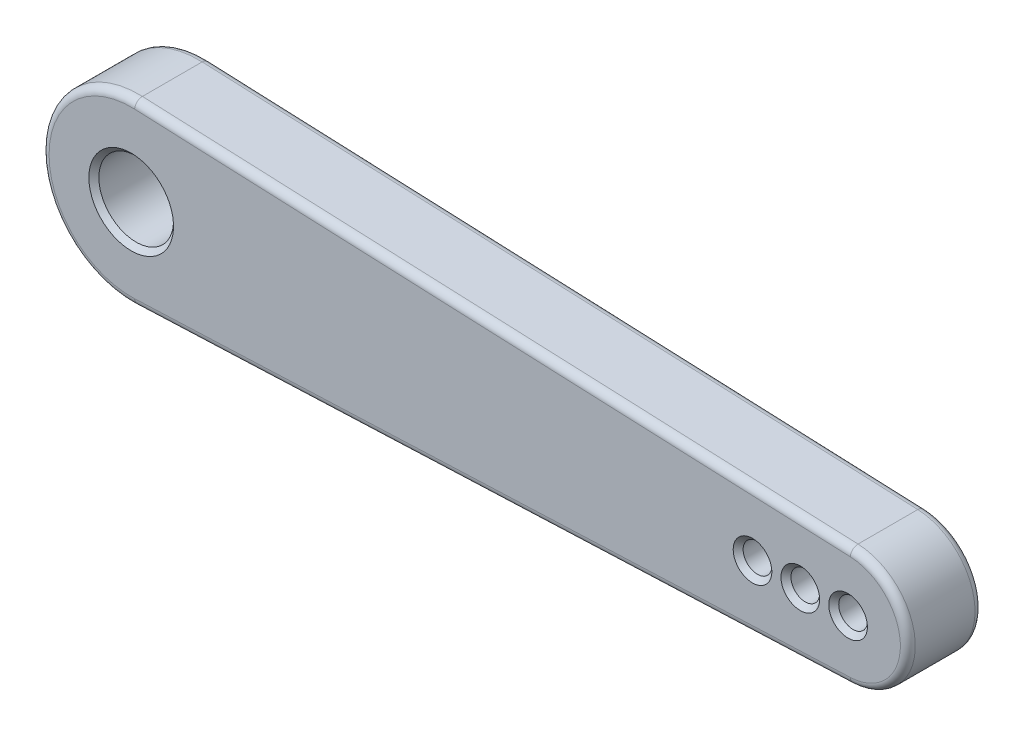
ISO-10303-21;
HEADER;
FILE_DESCRIPTION(('STEP AP214'),'2;1');
FILE_NAME('part.step','',(''),(''),'','','');
FILE_SCHEMA(('AUTOMOTIVE_DESIGN { 1 0 10303 214 1 1 1 1 }'));
ENDSEC;
DATA;
#1=APPLICATION_CONTEXT('core data for automotive mechanical design processes');
#2=APPLICATION_PROTOCOL_DEFINITION('international standard','automotive_design',2000,#1);
#3=PRODUCT_CONTEXT('',#1,'mechanical');
#4=PRODUCT('Part','Part','',(#3));
#5=PRODUCT_RELATED_PRODUCT_CATEGORY('part','',(#4));
#6=PRODUCT_DEFINITION_FORMATION('','',#4);
#7=PRODUCT_DEFINITION_CONTEXT('part definition',#1,'design');
#8=PRODUCT_DEFINITION('design','',#6,#7);
#9=PRODUCT_DEFINITION_SHAPE('','',#8);
#10=(LENGTH_UNIT() NAMED_UNIT(*) SI_UNIT(.MILLI.,.METRE.));
#11=(NAMED_UNIT(*) PLANE_ANGLE_UNIT() SI_UNIT($,.RADIAN.));
#12=(NAMED_UNIT(*) SI_UNIT($,.STERADIAN.) SOLID_ANGLE_UNIT());
#13=UNCERTAINTY_MEASURE_WITH_UNIT(LENGTH_MEASURE(1.E-05),#10,'distance_accuracy_value','');
#14=(GEOMETRIC_REPRESENTATION_CONTEXT(3) GLOBAL_UNCERTAINTY_ASSIGNED_CONTEXT((#13)) GLOBAL_UNIT_ASSIGNED_CONTEXT((#10,
#11,#12)) REPRESENTATION_CONTEXT('',''));
#15=CARTESIAN_POINT('',(0.,0.,0.));
#16=DIRECTION('',(0.,0.,1.));
#17=DIRECTION('',(1.,0.,0.));
#18=AXIS2_PLACEMENT_3D('',#15,#16,#17);
#19=CARTESIAN_POINT('',(-38.1,-2.61384973715095E-13,7.9375));
#20=DIRECTION('',(0.,0.,-1.));
#21=DIRECTION('',(-1.,0.,0.));
#22=AXIS2_PLACEMENT_3D('',#19,#20,#21);
#23=PLANE('',#22);
#24=CARTESIAN_POINT('',(38.1,2.61384973715095E-13,7.9375));
#25=DIRECTION('',(0.,0.,-1.));
#26=DIRECTION('',(-1.,0.,0.));
#27=AXIS2_PLACEMENT_3D('',#24,#25,#26);
#28=CIRCLE('',#27,2.05316666666658);
#29=CARTESIAN_POINT('',(36.0468333333334,2.61384973715095E-13,7.9375));
#30=VERTEX_POINT('',#29);
#31=EDGE_CURVE('E180',#30,#30,#28,.T.);
#32=ORIENTED_EDGE('',*,*,#31,.T.);
#33=EDGE_LOOP('',(#32));
#34=FACE_BOUND('',#33,.T.);
#35=CARTESIAN_POINT('',(33.02,2.2591152331245E-13,7.9375));
#36=DIRECTION('',(0.,0.,-1.));
#37=DIRECTION('',(-1.,0.,0.));
#38=AXIS2_PLACEMENT_3D('',#35,#36,#37);
#39=CIRCLE('',#38,2.05316666666658);
#40=CARTESIAN_POINT('',(30.9668333333334,2.2591152331245E-13,7.9375));
#41=VERTEX_POINT('',#40);
#42=EDGE_CURVE('E177',#41,#41,#39,.T.);
#43=ORIENTED_EDGE('',*,*,#42,.T.);
#44=EDGE_LOOP('',(#43));
#45=FACE_BOUND('',#44,.T.);
#46=CARTESIAN_POINT('',(27.94,1.90243660230438E-13,7.9375));
#47=DIRECTION('',(0.,0.,-1.));
#48=DIRECTION('',(-1.,0.,0.));
#49=AXIS2_PLACEMENT_3D('',#46,#47,#48);
#50=CIRCLE('',#49,2.05316666666666);
#51=CARTESIAN_POINT('',(25.8868333333333,1.90243660230438E-13,7.9375));
#52=VERTEX_POINT('',#51);
#53=EDGE_CURVE('E174',#52,#52,#50,.T.);
#54=ORIENTED_EDGE('',*,*,#53,.T.);
#55=EDGE_LOOP('',(#54));
#56=FACE_BOUND('',#55,.T.);
#57=CARTESIAN_POINT('',(-38.1,-2.61384973715095E-13,7.9375));
#58=DIRECTION('',(0.,0.,-1.));
#59=DIRECTION('',(-1.,0.,0.));
#60=AXIS2_PLACEMENT_3D('',#57,#58,#59);
#61=CIRCLE('',#60,4.49791666666674);
#62=CARTESIAN_POINT('',(-42.5979166666667,-2.61384973715095E-13,7.9375));
#63=VERTEX_POINT('',#62);
#64=EDGE_CURVE('E171',#63,#63,#61,.T.);
#65=ORIENTED_EDGE('',*,*,#64,.T.);
#66=EDGE_LOOP('',(#65));
#67=FACE_BOUND('',#66,.T.);
#68=DIRECTION('',(0.999131567356816,0.0416666666666735,0.));
#69=VECTOR('',#68,1.);
#70=CARTESIAN_POINT('',(-37.7361979166666,-8.72366749748447,7.9375));
#71=LINE('',#70,#69);
#72=CARTESIAN_POINT('',(-37.7361979166666,-8.72366749748447,7.9375));
#73=VERTEX_POINT('',#72);
#74=CARTESIAN_POINT('',(38.3315104166667,-5.55142477112605,7.9375));
#75=VERTEX_POINT('',#74);
#76=EDGE_CURVE('E54',#73,#75,#71,.T.);
#77=ORIENTED_EDGE('',*,*,#76,.T.);
#78=CARTESIAN_POINT('',(38.1,2.61384973715095E-13,7.9375));
#79=DIRECTION('',(0.,0.,-1.));
#80=DIRECTION('',(-1.,0.,0.));
#81=AXIS2_PLACEMENT_3D('',#78,#79,#80);
#82=CIRCLE('',#81,5.55625);
#83=CARTESIAN_POINT('',(38.3315104166666,5.55142477112657,7.9375));
#84=VERTEX_POINT('',#83);
#85=EDGE_CURVE('E116',#75,#84,#82,.F.);
#86=ORIENTED_EDGE('',*,*,#85,.T.);
#87=DIRECTION('',(-0.999131567356817,0.0416666666666598,0.));
#88=VECTOR('',#87,1.);
#89=CARTESIAN_POINT('',(-37.7361979166667,8.72366749748394,7.9375));
#90=LINE('',#89,#88);
#91=CARTESIAN_POINT('',(-37.7361979166667,8.72366749748394,7.9375));
#92=VERTEX_POINT('',#91);
#93=EDGE_CURVE('E140',#84,#92,#90,.T.);
#94=ORIENTED_EDGE('',*,*,#93,.T.);
#95=CARTESIAN_POINT('',(-38.1,-2.61384973715095E-13,7.9375));
#96=DIRECTION('',(0.,0.,-1.));
#97=DIRECTION('',(-1.,0.,0.));
#98=AXIS2_PLACEMENT_3D('',#95,#96,#97);
#99=CIRCLE('',#98,8.73125);
#100=EDGE_CURVE('E59',#92,#73,#99,.F.);
#101=ORIENTED_EDGE('',*,*,#100,.T.);
#102=EDGE_LOOP('',(#77,#86,#94,#101));
#103=FACE_BOUND('',#102,.T.);
#104=ADVANCED_FACE('F38',(#34,#45,#56,#67,#103),#23,.F.);
#105=CARTESIAN_POINT('',(-38.1,-2.61384973715095E-13,0.));
#106=DIRECTION('',(0.,0.,-1.));
#107=DIRECTION('',(-1.,0.,0.));
#108=AXIS2_PLACEMENT_3D('',#105,#106,#107);
#109=PLANE('',#108);
#110=CARTESIAN_POINT('',(38.1,2.61384973715095E-13,0.));
#111=DIRECTION('',(0.,0.,-1.));
#112=DIRECTION('',(-1.,0.,0.));
#113=AXIS2_PLACEMENT_3D('',#110,#111,#112);
#114=CIRCLE('',#113,2.05316666666661);
#115=CARTESIAN_POINT('',(36.0468333333334,2.61384973715095E-13,0.));
#116=VERTEX_POINT('',#115);
#117=EDGE_CURVE('E162',#116,#116,#114,.F.);
#118=ORIENTED_EDGE('',*,*,#117,.T.);
#119=EDGE_LOOP('',(#118));
#120=FACE_BOUND('',#119,.T.);
#121=CARTESIAN_POINT('',(33.02,2.2591152331245E-13,0.));
#122=DIRECTION('',(0.,0.,-1.));
#123=DIRECTION('',(-1.,0.,0.));
#124=AXIS2_PLACEMENT_3D('',#121,#122,#123);
#125=CIRCLE('',#124,2.05316666666658);
#126=CARTESIAN_POINT('',(30.9668333333334,2.2591152331245E-13,0.));
#127=VERTEX_POINT('',#126);
#128=EDGE_CURVE('E159',#127,#127,#125,.F.);
#129=ORIENTED_EDGE('',*,*,#128,.T.);
#130=EDGE_LOOP('',(#129));
#131=FACE_BOUND('',#130,.T.);
#132=CARTESIAN_POINT('',(27.94,1.90243660230438E-13,0.));
#133=DIRECTION('',(0.,0.,-1.));
#134=DIRECTION('',(-1.,0.,0.));
#135=AXIS2_PLACEMENT_3D('',#132,#133,#134);
#136=CIRCLE('',#135,2.05316666666669);
#137=CARTESIAN_POINT('',(25.8868333333333,1.90243660230438E-13,0.));
#138=VERTEX_POINT('',#137);
#139=EDGE_CURVE('E156',#138,#138,#136,.F.);
#140=ORIENTED_EDGE('',*,*,#139,.T.);
#141=EDGE_LOOP('',(#140));
#142=FACE_BOUND('',#141,.T.);
#143=CARTESIAN_POINT('',(-38.1,-2.61384973715095E-13,0.));
#144=DIRECTION('',(0.,0.,-1.));
#145=DIRECTION('',(-1.,0.,0.));
#146=AXIS2_PLACEMENT_3D('',#143,#144,#145);
#147=CIRCLE('',#146,4.49791666666678);
#148=CARTESIAN_POINT('',(-42.5979166666668,-2.61384973715095E-13,0.));
#149=VERTEX_POINT('',#148);
#150=EDGE_CURVE('E153',#149,#149,#147,.F.);
#151=ORIENTED_EDGE('',*,*,#150,.T.);
#152=EDGE_LOOP('',(#151));
#153=FACE_BOUND('',#152,.T.);
#154=DIRECTION('',(-0.999131567356817,0.0416666666666598,0.));
#155=VECTOR('',#154,1.);
#156=CARTESIAN_POINT('',(38.3315104166666,5.55142477112657,0.));
#157=LINE('',#156,#155);
#158=CARTESIAN_POINT('',(-37.7361979166667,8.72366749748394,0.));
#159=VERTEX_POINT('',#158);
#160=CARTESIAN_POINT('',(38.3315104166666,5.55142477112657,0.));
#161=VERTEX_POINT('',#160);
#162=EDGE_CURVE('E344',#159,#161,#157,.F.);
#163=ORIENTED_EDGE('',*,*,#162,.T.);
#164=CARTESIAN_POINT('',(38.1,2.61384973715095E-13,0.));
#165=DIRECTION('',(0.,0.,-1.));
#166=DIRECTION('',(-1.,0.,0.));
#167=AXIS2_PLACEMENT_3D('',#164,#165,#166);
#168=CIRCLE('',#167,5.55625);
#169=CARTESIAN_POINT('',(38.3315104166667,-5.55142477112605,0.));
#170=VERTEX_POINT('',#169);
#171=EDGE_CURVE('E346',#161,#170,#168,.T.);
#172=ORIENTED_EDGE('',*,*,#171,.T.);
#173=DIRECTION('',(0.999131567356816,0.0416666666666735,0.));
#174=VECTOR('',#173,1.);
#175=CARTESIAN_POINT('',(-37.7361979166666,-8.72366749748447,0.));
#176=LINE('',#175,#174);
#177=CARTESIAN_POINT('',(-37.7361979166666,-8.72366749748447,0.));
#178=VERTEX_POINT('',#177);
#179=EDGE_CURVE('E358',#170,#178,#176,.F.);
#180=ORIENTED_EDGE('',*,*,#179,.T.);
#181=CARTESIAN_POINT('',(-38.1,-2.61384973715095E-13,0.));
#182=DIRECTION('',(0.,0.,-1.));
#183=DIRECTION('',(-1.,0.,0.));
#184=AXIS2_PLACEMENT_3D('',#181,#182,#183);
#185=CIRCLE('',#184,8.73125);
#186=EDGE_CURVE('E348',#178,#159,#185,.T.);
#187=ORIENTED_EDGE('',*,*,#186,.T.);
#188=EDGE_LOOP('',(#163,#172,#180,#187));
#189=FACE_BOUND('',#188,.T.);
#190=ADVANCED_FACE('F209',(#120,#131,#142,#153,#189),#109,.T.);
#191=CARTESIAN_POINT('',(-38.1,-2.61384973715095E-13,7.9375));
#192=DIRECTION('',(0.,0.,-1.));
#193=DIRECTION('',(-1.,0.,0.));
#194=AXIS2_PLACEMENT_3D('',#191,#192,#193);
#195=CYLINDRICAL_SURFACE('',#194,9.525);
#196=DIRECTION('',(0.,0.,-1.));
#197=VECTOR('',#196,1.);
#198=CARTESIAN_POINT('',(-37.7031250000001,9.51672817907341,7.9375));
#199=LINE('',#198,#197);
#200=CARTESIAN_POINT('',(-37.7031250000001,9.51672817907341,7.14375));
#201=VERTEX_POINT('',#200);
#202=CARTESIAN_POINT('',(-37.7031250000001,9.51672817907341,0.79375));
#203=VERTEX_POINT('',#202);
#204=EDGE_CURVE('E110',#201,#203,#199,.T.);
#205=ORIENTED_EDGE('',*,*,#204,.T.);
#206=CARTESIAN_POINT('',(-38.1,-2.61384973715095E-13,0.79375));
#207=DIRECTION('',(0.,0.,-1.));
#208=DIRECTION('',(-1.,0.,0.));
#209=AXIS2_PLACEMENT_3D('',#206,#207,#208);
#210=CIRCLE('',#209,9.525);
#211=CARTESIAN_POINT('',(-37.7031249999999,-9.51672817907394,0.79375));
#212=VERTEX_POINT('',#211);
#213=EDGE_CURVE('E381',#203,#212,#210,.F.);
#214=ORIENTED_EDGE('',*,*,#213,.T.);
#215=DIRECTION('',(0.,0.,-1.));
#216=VECTOR('',#215,1.);
#217=CARTESIAN_POINT('',(-37.7031249999999,-9.51672817907394,7.9375));
#218=LINE('',#217,#216);
#219=CARTESIAN_POINT('',(-37.7031249999999,-9.51672817907394,7.14375));
#220=VERTEX_POINT('',#219);
#221=EDGE_CURVE('E137',#220,#212,#218,.T.);
#222=ORIENTED_EDGE('',*,*,#221,.F.);
#223=CARTESIAN_POINT('',(-38.1,-2.61384973715095E-13,7.14375));
#224=DIRECTION('',(0.,0.,-1.));
#225=DIRECTION('',(-1.,0.,0.));
#226=AXIS2_PLACEMENT_3D('',#223,#224,#225);
#227=CIRCLE('',#226,9.525);
#228=EDGE_CURVE('E379',#220,#201,#227,.T.);
#229=ORIENTED_EDGE('',*,*,#228,.T.);
#230=EDGE_LOOP('',(#205,#214,#222,#229));
#231=FACE_BOUND('',#230,.T.);
#232=ADVANCED_FACE('F215',(#231),#195,.T.);
#233=CARTESIAN_POINT('',(38.3645833333334,-6.34448545271552,7.9375));
#234=DIRECTION('',(-0.0416666666666735,0.999131567356816,0.));
#235=DIRECTION('',(-0.999131567356816,-0.0416666666666735,0.));
#236=AXIS2_PLACEMENT_3D('',#233,#234,#235);
#237=PLANE('',#236);
#238=ORIENTED_EDGE('',*,*,#221,.T.);
#239=DIRECTION('',(0.999131567356816,0.0416666666666735,0.));
#240=VECTOR('',#239,1.);
#241=CARTESIAN_POINT('',(38.3645833333334,-6.34448545271552,0.79375));
#242=LINE('',#241,#240);
#243=CARTESIAN_POINT('',(38.3645833333334,-6.34448545271552,0.79375));
#244=VERTEX_POINT('',#243);
#245=EDGE_CURVE('E377',#212,#244,#242,.T.);
#246=ORIENTED_EDGE('',*,*,#245,.T.);
#247=DIRECTION('',(0.,0.,-1.));
#248=VECTOR('',#247,1.);
#249=CARTESIAN_POINT('',(38.3645833333334,-6.34448545271552,7.9375));
#250=LINE('',#249,#248);
#251=CARTESIAN_POINT('',(38.3645833333334,-6.34448545271552,7.14375));
#252=VERTEX_POINT('',#251);
#253=EDGE_CURVE('E128',#252,#244,#250,.T.);
#254=ORIENTED_EDGE('',*,*,#253,.F.);
#255=DIRECTION('',(0.999131567356816,0.0416666666666735,0.));
#256=VECTOR('',#255,1.);
#257=CARTESIAN_POINT('',(38.3645833333334,-6.34448545271552,7.14375));
#258=LINE('',#257,#256);
#259=EDGE_CURVE('E357',#252,#220,#258,.F.);
#260=ORIENTED_EDGE('',*,*,#259,.T.);
#261=EDGE_LOOP('',(#238,#246,#254,#260));
#262=FACE_BOUND('',#261,.T.);
#263=ADVANCED_FACE('F226',(#262),#237,.F.);
#264=CARTESIAN_POINT('',(38.1,2.61384973715095E-13,7.9375));
#265=DIRECTION('',(0.,0.,-1.));
#266=DIRECTION('',(-1.,0.,0.));
#267=AXIS2_PLACEMENT_3D('',#264,#265,#266);
#268=CYLINDRICAL_SURFACE('',#267,6.35);
#269=ORIENTED_EDGE('',*,*,#253,.T.);
#270=CARTESIAN_POINT('',(38.1,2.61384973715095E-13,0.79375));
#271=DIRECTION('',(0.,0.,-1.));
#272=DIRECTION('',(-1.,0.,0.));
#273=AXIS2_PLACEMENT_3D('',#270,#271,#272);
#274=CIRCLE('',#273,6.35);
#275=CARTESIAN_POINT('',(38.3645833333333,6.34448545271604,0.79375));
#276=VERTEX_POINT('',#275);
#277=EDGE_CURVE('E127',#244,#276,#274,.F.);
#278=ORIENTED_EDGE('',*,*,#277,.T.);
#279=DIRECTION('',(0.,0.,-1.));
#280=VECTOR('',#279,1.);
#281=CARTESIAN_POINT('',(38.3645833333333,6.34448545271604,7.9375));
#282=LINE('',#281,#280);
#283=CARTESIAN_POINT('',(38.3645833333333,6.34448545271604,7.14375));
#284=VERTEX_POINT('',#283);
#285=EDGE_CURVE('E108',#284,#276,#282,.T.);
#286=ORIENTED_EDGE('',*,*,#285,.F.);
#287=CARTESIAN_POINT('',(38.1,2.61384973715095E-13,7.14375));
#288=DIRECTION('',(0.,0.,-1.));
#289=DIRECTION('',(-1.,0.,0.));
#290=AXIS2_PLACEMENT_3D('',#287,#288,#289);
#291=CIRCLE('',#290,6.35);
#292=EDGE_CURVE('E124',#284,#252,#291,.T.);
#293=ORIENTED_EDGE('',*,*,#292,.T.);
#294=EDGE_LOOP('',(#269,#278,#286,#293));
#295=FACE_BOUND('',#294,.T.);
#296=ADVANCED_FACE('F123',(#295),#268,.T.);
#297=CARTESIAN_POINT('',(-37.7031250000001,9.51672817907341,7.9375));
#298=DIRECTION('',(-0.0416666666666598,-0.999131567356817,0.));
#299=DIRECTION('',(0.999131567356817,-0.0416666666666598,0.));
#300=AXIS2_PLACEMENT_3D('',#297,#298,#299);
#301=PLANE('',#300);
#302=ORIENTED_EDGE('',*,*,#285,.T.);
#303=DIRECTION('',(-0.999131567356817,0.0416666666666598,0.));
#304=VECTOR('',#303,1.);
#305=CARTESIAN_POINT('',(-37.7031250000001,9.51672817907341,0.79375));
#306=LINE('',#305,#304);
#307=EDGE_CURVE('E115',#276,#203,#306,.T.);
#308=ORIENTED_EDGE('',*,*,#307,.T.);
#309=ORIENTED_EDGE('',*,*,#204,.F.);
#310=DIRECTION('',(-0.999131567356817,0.0416666666666598,0.));
#311=VECTOR('',#310,1.);
#312=CARTESIAN_POINT('',(-37.7031250000001,9.51672817907341,7.14375));
#313=LINE('',#312,#311);
#314=EDGE_CURVE('E105',#201,#284,#313,.F.);
#315=ORIENTED_EDGE('',*,*,#314,.T.);
#316=EDGE_LOOP('',(#302,#308,#309,#315));
#317=FACE_BOUND('',#316,.T.);
#318=ADVANCED_FACE('F107',(#317),#301,.F.);
#319=CARTESIAN_POINT('',(-38.1,-2.61384973715095E-13,7.9375));
#320=DIRECTION('',(0.,0.,-1.));
#321=DIRECTION('',(-1.,0.,0.));
#322=AXIS2_PLACEMENT_3D('',#319,#320,#321);
#323=CYLINDRICAL_SURFACE('',#322,3.96875000000008);
#324=CARTESIAN_POINT('',(-38.1,-2.61384973715095E-13,0.529166666666684));
#325=DIRECTION('',(0.,0.,-1.));
#326=DIRECTION('',(-1.,0.,0.));
#327=AXIS2_PLACEMENT_3D('',#324,#325,#326);
#328=CIRCLE('',#327,3.96875000000008);
#329=CARTESIAN_POINT('',(-42.0687500000001,-2.61384973715095E-13,0.529166666666684));
#330=VERTEX_POINT('',#329);
#331=EDGE_CURVE('E11',#330,#330,#328,.T.);
#332=ORIENTED_EDGE('',*,*,#331,.T.);
#333=EDGE_LOOP('',(#332));
#334=FACE_BOUND('',#333,.T.);
#335=CARTESIAN_POINT('',(-38.1,-2.61384973715095E-13,7.40833333333335));
#336=DIRECTION('',(0.,0.,-1.));
#337=DIRECTION('',(-1.,0.,0.));
#338=AXIS2_PLACEMENT_3D('',#335,#336,#337);
#339=CIRCLE('',#338,3.96875000000008);
#340=CARTESIAN_POINT('',(-42.0687500000001,-2.61384973715095E-13,7.40833333333335));
#341=VERTEX_POINT('',#340);
#342=EDGE_CURVE('E47',#341,#341,#339,.F.);
#343=ORIENTED_EDGE('',*,*,#342,.T.);
#344=EDGE_LOOP('',(#343));
#345=FACE_BOUND('',#344,.T.);
#346=ADVANCED_FACE('F197',(#334,#345),#323,.F.);
#347=CARTESIAN_POINT('',(38.1,2.61384973715095E-13,7.9375));
#348=DIRECTION('',(0.,0.,-1.));
#349=DIRECTION('',(-1.,0.,0.));
#350=AXIS2_PLACEMENT_3D('',#347,#348,#349);
#351=CYLINDRICAL_SURFACE('',#350,1.52399999999992);
#352=CARTESIAN_POINT('',(38.1,2.61384973715095E-13,0.529166666666679));
#353=DIRECTION('',(0.,0.,-1.));
#354=DIRECTION('',(-1.,0.,0.));
#355=AXIS2_PLACEMENT_3D('',#352,#353,#354);
#356=CIRCLE('',#355,1.52399999999992);
#357=CARTESIAN_POINT('',(36.5760000000001,2.61384973715095E-13,0.529166666666679));
#358=VERTEX_POINT('',#357);
#359=EDGE_CURVE('E168',#358,#358,#356,.T.);
#360=ORIENTED_EDGE('',*,*,#359,.T.);
#361=EDGE_LOOP('',(#360));
#362=FACE_BOUND('',#361,.T.);
#363=CARTESIAN_POINT('',(38.1,2.61384973715095E-13,7.40833333333335));
#364=DIRECTION('',(0.,0.,-1.));
#365=DIRECTION('',(-1.,0.,0.));
#366=AXIS2_PLACEMENT_3D('',#363,#364,#365);
#367=CIRCLE('',#366,1.52399999999992);
#368=CARTESIAN_POINT('',(36.5760000000001,2.61384973715095E-13,7.40833333333335));
#369=VERTEX_POINT('',#368);
#370=EDGE_CURVE('E165',#369,#369,#367,.F.);
#371=ORIENTED_EDGE('',*,*,#370,.T.);
#372=EDGE_LOOP('',(#371));
#373=FACE_BOUND('',#372,.T.);
#374=ADVANCED_FACE('F320',(#362,#373),#351,.F.);
#375=CARTESIAN_POINT('',(33.02,2.2591152331245E-13,7.9375));
#376=DIRECTION('',(0.,0.,-1.));
#377=DIRECTION('',(-1.,0.,0.));
#378=AXIS2_PLACEMENT_3D('',#375,#376,#377);
#379=CYLINDRICAL_SURFACE('',#378,1.52399999999991);
#380=CARTESIAN_POINT('',(33.02,2.2591152331245E-13,0.529166666666668));
#381=DIRECTION('',(0.,0.,-1.));
#382=DIRECTION('',(-1.,0.,0.));
#383=AXIS2_PLACEMENT_3D('',#380,#381,#382);
#384=CIRCLE('',#383,1.52399999999991);
#385=CARTESIAN_POINT('',(31.4960000000001,2.2591152331245E-13,0.529166666666668));
#386=VERTEX_POINT('',#385);
#387=EDGE_CURVE('E186',#386,#386,#384,.T.);
#388=ORIENTED_EDGE('',*,*,#387,.T.);
#389=EDGE_LOOP('',(#388));
#390=FACE_BOUND('',#389,.T.);
#391=CARTESIAN_POINT('',(33.02,2.2591152331245E-13,7.40833333333335));
#392=DIRECTION('',(0.,0.,-1.));
#393=DIRECTION('',(-1.,0.,0.));
#394=AXIS2_PLACEMENT_3D('',#391,#392,#393);
#395=CIRCLE('',#394,1.52399999999991);
#396=CARTESIAN_POINT('',(31.4960000000001,2.2591152331245E-13,7.40833333333335));
#397=VERTEX_POINT('',#396);
#398=EDGE_CURVE('E183',#397,#397,#395,.F.);
#399=ORIENTED_EDGE('',*,*,#398,.T.);
#400=EDGE_LOOP('',(#399));
#401=FACE_BOUND('',#400,.T.);
#402=ADVANCED_FACE('F314',(#390,#401),#379,.F.);
#403=CARTESIAN_POINT('',(27.94,1.90243660230438E-13,7.9375));
#404=DIRECTION('',(0.,0.,-1.));
#405=DIRECTION('',(-1.,0.,0.));
#406=AXIS2_PLACEMENT_3D('',#403,#404,#405);
#407=CYLINDRICAL_SURFACE('',#406,1.52400000000001);
#408=CARTESIAN_POINT('',(27.94,1.90243660230438E-13,0.529166666666682));
#409=DIRECTION('',(0.,0.,-1.));
#410=DIRECTION('',(-1.,0.,0.));
#411=AXIS2_PLACEMENT_3D('',#408,#409,#410);
#412=CIRCLE('',#411,1.52400000000001);
#413=CARTESIAN_POINT('',(26.416,1.90243660230438E-13,0.529166666666682));
#414=VERTEX_POINT('',#413);
#415=EDGE_CURVE('E192',#414,#414,#412,.T.);
#416=ORIENTED_EDGE('',*,*,#415,.T.);
#417=EDGE_LOOP('',(#416));
#418=FACE_BOUND('',#417,.T.);
#419=CARTESIAN_POINT('',(27.94,1.90243660230438E-13,7.40833333333335));
#420=DIRECTION('',(0.,0.,-1.));
#421=DIRECTION('',(-1.,0.,0.));
#422=AXIS2_PLACEMENT_3D('',#419,#420,#421);
#423=CIRCLE('',#422,1.52400000000001);
#424=CARTESIAN_POINT('',(26.416,1.90243660230438E-13,7.40833333333335));
#425=VERTEX_POINT('',#424);
#426=EDGE_CURVE('E189',#425,#425,#423,.F.);
#427=ORIENTED_EDGE('',*,*,#426,.T.);
#428=EDGE_LOOP('',(#427));
#429=FACE_BOUND('',#428,.T.);
#430=ADVANCED_FACE('F249',(#418,#429),#407,.F.);
#431=CARTESIAN_POINT('',(-38.1,-2.61384973715095E-13,0.79375));
#432=DIRECTION('',(0.,0.,-1.));
#433=DIRECTION('',(-1.,0.,0.));
#434=AXIS2_PLACEMENT_3D('',#431,#432,#433);
#435=TOROIDAL_SURFACE('',#434,8.73125,0.79375);
#436=CARTESIAN_POINT('',(-37.7361979166667,8.72366749748394,0.79375));
#437=DIRECTION('',(0.999131567356817,-0.0416666666666599,0.));
#438=DIRECTION('',(0.0416666666666599,0.999131567356817,0.));
#439=AXIS2_PLACEMENT_3D('',#436,#437,#438);
#440=CIRCLE('',#439,0.79375);
#441=EDGE_CURVE('E361',#159,#203,#440,.T.);
#442=ORIENTED_EDGE('',*,*,#441,.F.);
#443=ORIENTED_EDGE('',*,*,#186,.F.);
#444=CARTESIAN_POINT('',(-37.7361979166666,-8.72366749748447,0.79375));
#445=DIRECTION('',(0.999131567356816,0.0416666666666774,0.));
#446=DIRECTION('',(-0.0416666666666774,0.999131567356816,0.));
#447=AXIS2_PLACEMENT_3D('',#444,#445,#446);
#448=CIRCLE('',#447,0.79375);
#449=EDGE_CURVE('E145',#212,#178,#448,.T.);
#450=ORIENTED_EDGE('',*,*,#449,.F.);
#451=ORIENTED_EDGE('',*,*,#213,.F.);
#452=EDGE_LOOP('',(#442,#443,#450,#451));
#453=FACE_BOUND('',#452,.T.);
#454=ADVANCED_FACE('F245',(#453),#435,.T.);
#455=CARTESIAN_POINT('',(38.3315104166667,-5.55142477112605,0.79375));
#456=DIRECTION('',(-0.999131567356816,-0.0416666666666735,0.));
#457=DIRECTION('',(0.0416666666666735,-0.999131567356816,0.));
#458=AXIS2_PLACEMENT_3D('',#455,#456,#457);
#459=CYLINDRICAL_SURFACE('',#458,0.79375);
#460=ORIENTED_EDGE('',*,*,#449,.T.);
#461=ORIENTED_EDGE('',*,*,#179,.F.);
#462=CARTESIAN_POINT('',(38.3315104166667,-5.55142477112605,0.79375));
#463=DIRECTION('',(0.999131567356816,0.0416666666666774,0.));
#464=DIRECTION('',(-0.0416666666666774,0.999131567356816,0.));
#465=AXIS2_PLACEMENT_3D('',#462,#463,#464);
#466=CIRCLE('',#465,0.79375);
#467=EDGE_CURVE('E355',#244,#170,#466,.T.);
#468=ORIENTED_EDGE('',*,*,#467,.F.);
#469=ORIENTED_EDGE('',*,*,#245,.F.);
#470=EDGE_LOOP('',(#460,#461,#468,#469));
#471=FACE_BOUND('',#470,.T.);
#472=ADVANCED_FACE('F241',(#471),#459,.T.);
#473=CARTESIAN_POINT('',(-37.7361979166667,8.72366749748394,0.79375));
#474=DIRECTION('',(0.999131567356817,-0.0416666666666598,0.));
#475=DIRECTION('',(0.0416666666666598,0.999131567356817,0.));
#476=AXIS2_PLACEMENT_3D('',#473,#474,#475);
#477=CYLINDRICAL_SURFACE('',#476,0.79375);
#478=ORIENTED_EDGE('',*,*,#441,.T.);
#479=ORIENTED_EDGE('',*,*,#307,.F.);
#480=CARTESIAN_POINT('',(38.3315104166666,5.55142477112657,0.79375));
#481=DIRECTION('',(0.999131567356817,-0.0416666666666599,0.));
#482=DIRECTION('',(0.0416666666666599,0.999131567356817,0.));
#483=AXIS2_PLACEMENT_3D('',#480,#481,#482);
#484=CIRCLE('',#483,0.79375);
#485=EDGE_CURVE('E152',#161,#276,#484,.T.);
#486=ORIENTED_EDGE('',*,*,#485,.F.);
#487=ORIENTED_EDGE('',*,*,#162,.F.);
#488=EDGE_LOOP('',(#478,#479,#486,#487));
#489=FACE_BOUND('',#488,.T.);
#490=ADVANCED_FACE('F237',(#489),#477,.T.);
#491=CARTESIAN_POINT('',(38.1,2.61384973715095E-13,0.79375));
#492=DIRECTION('',(0.,0.,-1.));
#493=DIRECTION('',(-1.,0.,0.));
#494=AXIS2_PLACEMENT_3D('',#491,#492,#493);
#495=TOROIDAL_SURFACE('',#494,5.55625,0.79375);
#496=ORIENTED_EDGE('',*,*,#467,.T.);
#497=ORIENTED_EDGE('',*,*,#171,.F.);
#498=ORIENTED_EDGE('',*,*,#485,.T.);
#499=ORIENTED_EDGE('',*,*,#277,.F.);
#500=EDGE_LOOP('',(#496,#497,#498,#499));
#501=FACE_BOUND('',#500,.T.);
#502=ADVANCED_FACE('F233',(#501),#495,.T.);
#503=CARTESIAN_POINT('',(-38.1,-2.61384973715095E-13,7.14375));
#504=DIRECTION('',(0.,0.,-1.));
#505=DIRECTION('',(-1.,0.,0.));
#506=AXIS2_PLACEMENT_3D('',#503,#504,#505);
#507=TOROIDAL_SURFACE('',#506,8.73125,0.79375);
#508=CARTESIAN_POINT('',(-37.7361979166667,8.72366749748394,7.14375));
#509=DIRECTION('',(0.999131567356817,-0.0416666666666599,0.));
#510=DIRECTION('',(0.0416666666666599,0.999131567356817,0.));
#511=AXIS2_PLACEMENT_3D('',#508,#509,#510);
#512=CIRCLE('',#511,0.79375);
#513=EDGE_CURVE('E142',#201,#92,#512,.T.);
#514=ORIENTED_EDGE('',*,*,#513,.F.);
#515=ORIENTED_EDGE('',*,*,#228,.F.);
#516=CARTESIAN_POINT('',(-37.7361979166666,-8.72366749748447,7.14375));
#517=DIRECTION('',(0.999131567356816,0.0416666666666774,0.));
#518=DIRECTION('',(-0.0416666666666774,0.999131567356816,0.));
#519=AXIS2_PLACEMENT_3D('',#516,#517,#518);
#520=CIRCLE('',#519,0.79375);
#521=EDGE_CURVE('E149',#73,#220,#520,.T.);
#522=ORIENTED_EDGE('',*,*,#521,.F.);
#523=ORIENTED_EDGE('',*,*,#100,.F.);
#524=EDGE_LOOP('',(#514,#515,#522,#523));
#525=FACE_BOUND('',#524,.T.);
#526=ADVANCED_FACE('F236',(#525),#507,.T.);
#527=CARTESIAN_POINT('',(-37.7361979166666,-8.72366749748447,7.14375));
#528=DIRECTION('',(0.999131567356816,0.0416666666666735,0.));
#529=DIRECTION('',(-0.0416666666666735,0.999131567356816,0.));
#530=AXIS2_PLACEMENT_3D('',#527,#528,#529);
#531=CYLINDRICAL_SURFACE('',#530,0.79375);
#532=ORIENTED_EDGE('',*,*,#521,.T.);
#533=ORIENTED_EDGE('',*,*,#259,.F.);
#534=CARTESIAN_POINT('',(38.3315104166667,-5.55142477112605,7.14375));
#535=DIRECTION('',(0.999131567356816,0.0416666666666774,0.));
#536=DIRECTION('',(-0.0416666666666774,0.999131567356816,0.));
#537=AXIS2_PLACEMENT_3D('',#534,#535,#536);
#538=CIRCLE('',#537,0.79375);
#539=EDGE_CURVE('E135',#75,#252,#538,.T.);
#540=ORIENTED_EDGE('',*,*,#539,.F.);
#541=ORIENTED_EDGE('',*,*,#76,.F.);
#542=EDGE_LOOP('',(#532,#533,#540,#541));
#543=FACE_BOUND('',#542,.T.);
#544=ADVANCED_FACE('F256',(#543),#531,.T.);
#545=CARTESIAN_POINT('',(-37.7361979166667,8.72366749748394,7.14375));
#546=DIRECTION('',(-0.999131567356817,0.0416666666666598,0.));
#547=DIRECTION('',(-0.0416666666666598,-0.999131567356817,0.));
#548=AXIS2_PLACEMENT_3D('',#545,#546,#547);
#549=CYLINDRICAL_SURFACE('',#548,0.79375);
#550=ORIENTED_EDGE('',*,*,#513,.T.);
#551=ORIENTED_EDGE('',*,*,#93,.F.);
#552=CARTESIAN_POINT('',(38.3315104166666,5.55142477112657,7.14375));
#553=DIRECTION('',(0.999131567356817,-0.0416666666666599,0.));
#554=DIRECTION('',(0.0416666666666599,0.999131567356817,0.));
#555=AXIS2_PLACEMENT_3D('',#552,#553,#554);
#556=CIRCLE('',#555,0.79375);
#557=EDGE_CURVE('E133',#284,#84,#556,.T.);
#558=ORIENTED_EDGE('',*,*,#557,.F.);
#559=ORIENTED_EDGE('',*,*,#314,.F.);
#560=EDGE_LOOP('',(#550,#551,#558,#559));
#561=FACE_BOUND('',#560,.T.);
#562=ADVANCED_FACE('F139',(#561),#549,.T.);
#563=CARTESIAN_POINT('',(38.1,2.61384973715095E-13,7.14375));
#564=DIRECTION('',(0.,0.,-1.));
#565=DIRECTION('',(-1.,0.,0.));
#566=AXIS2_PLACEMENT_3D('',#563,#564,#565);
#567=TOROIDAL_SURFACE('',#566,5.55625,0.79375);
#568=ORIENTED_EDGE('',*,*,#539,.T.);
#569=ORIENTED_EDGE('',*,*,#292,.F.);
#570=ORIENTED_EDGE('',*,*,#557,.T.);
#571=ORIENTED_EDGE('',*,*,#85,.F.);
#572=EDGE_LOOP('',(#568,#569,#570,#571));
#573=FACE_BOUND('',#572,.T.);
#574=ADVANCED_FACE('F131',(#573),#567,.T.);
#575=CARTESIAN_POINT('',(38.1,2.61384973715095E-13,0.));
#576=DIRECTION('',(0.,0.,-1.));
#577=DIRECTION('',(-1.,0.,0.));
#578=AXIS2_PLACEMENT_3D('',#575,#576,#577);
#579=CONICAL_SURFACE('',#578,2.05316666666661,0.785398163397456);
#580=ORIENTED_EDGE('',*,*,#359,.F.);
#581=EDGE_LOOP('',(#580));
#582=FACE_BOUND('',#581,.T.);
#583=ORIENTED_EDGE('',*,*,#117,.F.);
#584=EDGE_LOOP('',(#583));
#585=FACE_BOUND('',#584,.T.);
#586=ADVANCED_FACE('F253',(#582,#585),#579,.F.);
#587=CARTESIAN_POINT('',(38.1,2.61384973715095E-13,7.40833333333335));
#588=DIRECTION('',(0.,0.,1.));
#589=DIRECTION('',(1.,0.,0.));
#590=AXIS2_PLACEMENT_3D('',#587,#588,#589);
#591=CONICAL_SURFACE('',#590,1.52399999999992,0.785398163397457);
#592=ORIENTED_EDGE('',*,*,#31,.F.);
#593=EDGE_LOOP('',(#592));
#594=FACE_BOUND('',#593,.T.);
#595=ORIENTED_EDGE('',*,*,#370,.F.);
#596=EDGE_LOOP('',(#595));
#597=FACE_BOUND('',#596,.T.);
#598=ADVANCED_FACE('F269',(#594,#597),#591,.F.);
#599=CARTESIAN_POINT('',(33.02,2.2591152331245E-13,0.));
#600=DIRECTION('',(0.,0.,-1.));
#601=DIRECTION('',(-1.,0.,0.));
#602=AXIS2_PLACEMENT_3D('',#599,#600,#601);
#603=CONICAL_SURFACE('',#602,2.05316666666658,0.785398163397444);
#604=ORIENTED_EDGE('',*,*,#387,.F.);
#605=EDGE_LOOP('',(#604));
#606=FACE_BOUND('',#605,.T.);
#607=ORIENTED_EDGE('',*,*,#128,.F.);
#608=EDGE_LOOP('',(#607));
#609=FACE_BOUND('',#608,.T.);
#610=ADVANCED_FACE('F276',(#606,#609),#603,.F.);
#611=CARTESIAN_POINT('',(33.02,2.2591152331245E-13,7.40833333333335));
#612=DIRECTION('',(0.,0.,1.));
#613=DIRECTION('',(1.,0.,0.));
#614=AXIS2_PLACEMENT_3D('',#611,#612,#613);
#615=CONICAL_SURFACE('',#614,1.52399999999991,0.785398163397457);
#616=ORIENTED_EDGE('',*,*,#42,.F.);
#617=EDGE_LOOP('',(#616));
#618=FACE_BOUND('',#617,.T.);
#619=ORIENTED_EDGE('',*,*,#398,.F.);
#620=EDGE_LOOP('',(#619));
#621=FACE_BOUND('',#620,.T.);
#622=ADVANCED_FACE('F283',(#618,#621),#615,.F.);
#623=CARTESIAN_POINT('',(27.94,1.90243660230438E-13,0.));
#624=DIRECTION('',(0.,0.,-1.));
#625=DIRECTION('',(-1.,0.,0.));
#626=AXIS2_PLACEMENT_3D('',#623,#624,#625);
#627=CONICAL_SURFACE('',#626,2.05316666666669,0.78539816339745);
#628=ORIENTED_EDGE('',*,*,#415,.F.);
#629=EDGE_LOOP('',(#628));
#630=FACE_BOUND('',#629,.T.);
#631=ORIENTED_EDGE('',*,*,#139,.F.);
#632=EDGE_LOOP('',(#631));
#633=FACE_BOUND('',#632,.T.);
#634=ADVANCED_FACE('F290',(#630,#633),#627,.F.);
#635=CARTESIAN_POINT('',(27.94,1.90243660230438E-13,7.40833333333335));
#636=DIRECTION('',(0.,0.,1.));
#637=DIRECTION('',(1.,0.,0.));
#638=AXIS2_PLACEMENT_3D('',#635,#636,#637);
#639=CONICAL_SURFACE('',#638,1.52400000000001,0.785398163397457);
#640=ORIENTED_EDGE('',*,*,#53,.F.);
#641=EDGE_LOOP('',(#640));
#642=FACE_BOUND('',#641,.T.);
#643=ORIENTED_EDGE('',*,*,#426,.F.);
#644=EDGE_LOOP('',(#643));
#645=FACE_BOUND('',#644,.T.);
#646=ADVANCED_FACE('F205',(#642,#645),#639,.F.);
#647=CARTESIAN_POINT('',(-38.1,-2.61384973715095E-13,0.));
#648=DIRECTION('',(0.,0.,-1.));
#649=DIRECTION('',(-1.,0.,0.));
#650=AXIS2_PLACEMENT_3D('',#647,#648,#649);
#651=CONICAL_SURFACE('',#650,4.49791666666678,0.785398163397461);
#652=ORIENTED_EDGE('',*,*,#331,.F.);
#653=EDGE_LOOP('',(#652));
#654=FACE_BOUND('',#653,.T.);
#655=ORIENTED_EDGE('',*,*,#150,.F.);
#656=EDGE_LOOP('',(#655));
#657=FACE_BOUND('',#656,.T.);
#658=ADVANCED_FACE('F200',(#654,#657),#651,.F.);
#659=CARTESIAN_POINT('',(-38.1,-2.61384973715095E-13,7.40833333333335));
#660=DIRECTION('',(0.,0.,1.));
#661=DIRECTION('',(1.,0.,0.));
#662=AXIS2_PLACEMENT_3D('',#659,#660,#661);
#663=CONICAL_SURFACE('',#662,3.96875000000008,0.78539816339745);
#664=ORIENTED_EDGE('',*,*,#64,.F.);
#665=EDGE_LOOP('',(#664));
#666=FACE_BOUND('',#665,.T.);
#667=ORIENTED_EDGE('',*,*,#342,.F.);
#668=EDGE_LOOP('',(#667));
#669=FACE_BOUND('',#668,.T.);
#670=ADVANCED_FACE('F41',(#666,#669),#663,.F.);
#671=CLOSED_SHELL('',(#104,#190,#232,#263,#296,#318,#346,#374,#402,#430,#454,#472,#490,#502,
#526,#544,#562,#574,#586,#598,#610,#622,#634,#646,#658,#670));
#672=MANIFOLD_SOLID_BREP('B2',#671);
#673=ADVANCED_BREP_SHAPE_REPRESENTATION('',(#18,#672),#14);
#674=SHAPE_DEFINITION_REPRESENTATION(#9,#673);
ENDSEC;
END-ISO-10303-21;
